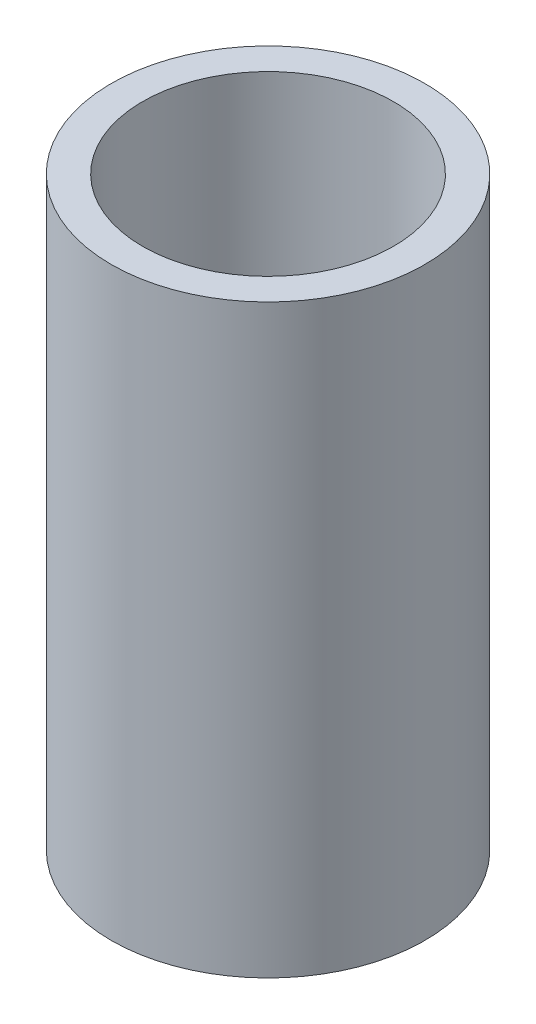
ISO-10303-21;
HEADER;
FILE_DESCRIPTION(('STEP AP214'),'2;1');
FILE_NAME('part.step','',(''),(''),'','','');
FILE_SCHEMA(('AUTOMOTIVE_DESIGN { 1 0 10303 214 1 1 1 1 }'));
ENDSEC;
DATA;
#1=APPLICATION_CONTEXT('core data for automotive mechanical design processes');
#2=APPLICATION_PROTOCOL_DEFINITION('international standard','automotive_design',2000,#1);
#3=PRODUCT_CONTEXT('',#1,'mechanical');
#4=PRODUCT('Part','Part','',(#3));
#5=PRODUCT_RELATED_PRODUCT_CATEGORY('part','',(#4));
#6=PRODUCT_DEFINITION_FORMATION('','',#4);
#7=PRODUCT_DEFINITION_CONTEXT('part definition',#1,'design');
#8=PRODUCT_DEFINITION('design','',#6,#7);
#9=PRODUCT_DEFINITION_SHAPE('','',#8);
#10=(LENGTH_UNIT() NAMED_UNIT(*) SI_UNIT(.MILLI.,.METRE.));
#11=(NAMED_UNIT(*) PLANE_ANGLE_UNIT() SI_UNIT($,.RADIAN.));
#12=(NAMED_UNIT(*) SI_UNIT($,.STERADIAN.) SOLID_ANGLE_UNIT());
#13=UNCERTAINTY_MEASURE_WITH_UNIT(LENGTH_MEASURE(1.E-05),#10,'distance_accuracy_value','');
#14=(GEOMETRIC_REPRESENTATION_CONTEXT(3) GLOBAL_UNCERTAINTY_ASSIGNED_CONTEXT((#13)) GLOBAL_UNIT_ASSIGNED_CONTEXT((#10,
#11,#12)) REPRESENTATION_CONTEXT('',''));
#15=CARTESIAN_POINT('',(0.,0.,0.));
#16=DIRECTION('',(0.,0.,1.));
#17=DIRECTION('',(1.,0.,0.));
#18=AXIS2_PLACEMENT_3D('',#15,#16,#17);
#19=CARTESIAN_POINT('',(0.,28.,0.));
#20=DIRECTION('',(0.,1.,0.));
#21=DIRECTION('',(0.,0.,1.));
#22=AXIS2_PLACEMENT_3D('',#19,#20,#21);
#23=PLANE('',#22);
#24=CARTESIAN_POINT('',(0.,28.,0.));
#25=DIRECTION('',(0.,1.,0.));
#26=DIRECTION('',(0.,0.,1.));
#27=AXIS2_PLACEMENT_3D('',#24,#25,#26);
#28=CIRCLE('',#27,7.5);
#29=CARTESIAN_POINT('',(0.,28.,7.5));
#30=VERTEX_POINT('',#29);
#31=EDGE_CURVE('E10',#30,#30,#28,.T.);
#32=ORIENTED_EDGE('',*,*,#31,.T.);
#33=EDGE_LOOP('',(#32));
#34=FACE_BOUND('',#33,.T.);
#35=CARTESIAN_POINT('',(0.,28.,0.));
#36=DIRECTION('',(0.,1.,0.));
#37=DIRECTION('',(0.,0.,1.));
#38=AXIS2_PLACEMENT_3D('',#35,#36,#37);
#39=CIRCLE('',#38,6.);
#40=CARTESIAN_POINT('',(0.,28.,6.));
#41=VERTEX_POINT('',#40);
#42=EDGE_CURVE('E46',#41,#41,#39,.T.);
#43=ORIENTED_EDGE('',*,*,#42,.F.);
#44=EDGE_LOOP('',(#43));
#45=FACE_BOUND('',#44,.T.);
#46=ADVANCED_FACE('F32',(#34,#45),#23,.T.);
#47=CARTESIAN_POINT('',(0.,0.,0.));
#48=DIRECTION('',(0.,1.,0.));
#49=DIRECTION('',(0.,0.,1.));
#50=AXIS2_PLACEMENT_3D('',#47,#48,#49);
#51=PLANE('',#50);
#52=CARTESIAN_POINT('',(0.,0.,0.));
#53=DIRECTION('',(0.,1.,0.));
#54=DIRECTION('',(0.,0.,1.));
#55=AXIS2_PLACEMENT_3D('',#52,#53,#54);
#56=CIRCLE('',#55,7.5);
#57=CARTESIAN_POINT('',(0.,0.,7.5));
#58=VERTEX_POINT('',#57);
#59=EDGE_CURVE('E36',#58,#58,#56,.T.);
#60=ORIENTED_EDGE('',*,*,#59,.F.);
#61=EDGE_LOOP('',(#60));
#62=FACE_BOUND('',#61,.T.);
#63=CARTESIAN_POINT('',(0.,0.,0.));
#64=DIRECTION('',(0.,1.,0.));
#65=DIRECTION('',(0.,0.,1.));
#66=AXIS2_PLACEMENT_3D('',#63,#64,#65);
#67=CIRCLE('',#66,6.);
#68=CARTESIAN_POINT('',(0.,0.,6.));
#69=VERTEX_POINT('',#68);
#70=EDGE_CURVE('E48',#69,#69,#67,.T.);
#71=ORIENTED_EDGE('',*,*,#70,.T.);
#72=EDGE_LOOP('',(#71));
#73=FACE_BOUND('',#72,.T.);
#74=ADVANCED_FACE('F61',(#62,#73),#51,.F.);
#75=CARTESIAN_POINT('',(0.,28.,0.));
#76=DIRECTION('',(0.,-1.,0.));
#77=DIRECTION('',(0.,0.,-1.));
#78=AXIS2_PLACEMENT_3D('',#75,#76,#77);
#79=CYLINDRICAL_SURFACE('',#78,7.5);
#80=ORIENTED_EDGE('',*,*,#31,.F.);
#81=EDGE_LOOP('',(#80));
#82=FACE_BOUND('',#81,.T.);
#83=ORIENTED_EDGE('',*,*,#59,.T.);
#84=EDGE_LOOP('',(#83));
#85=FACE_BOUND('',#84,.T.);
#86=ADVANCED_FACE('F34',(#82,#85),#79,.T.);
#87=CARTESIAN_POINT('',(0.,28.,0.));
#88=DIRECTION('',(0.,-1.,0.));
#89=DIRECTION('',(0.,0.,-1.));
#90=AXIS2_PLACEMENT_3D('',#87,#88,#89);
#91=CYLINDRICAL_SURFACE('',#90,6.);
#92=ORIENTED_EDGE('',*,*,#42,.T.);
#93=EDGE_LOOP('',(#92));
#94=FACE_BOUND('',#93,.T.);
#95=ORIENTED_EDGE('',*,*,#70,.F.);
#96=EDGE_LOOP('',(#95));
#97=FACE_BOUND('',#96,.T.);
#98=ADVANCED_FACE('F57',(#94,#97),#91,.F.);
#99=CLOSED_SHELL('',(#46,#74,#86,#98));
#100=MANIFOLD_SOLID_BREP('B2',#99);
#101=ADVANCED_BREP_SHAPE_REPRESENTATION('',(#18,#100),#14);
#102=SHAPE_DEFINITION_REPRESENTATION(#9,#101);
ENDSEC;
END-ISO-10303-21;
